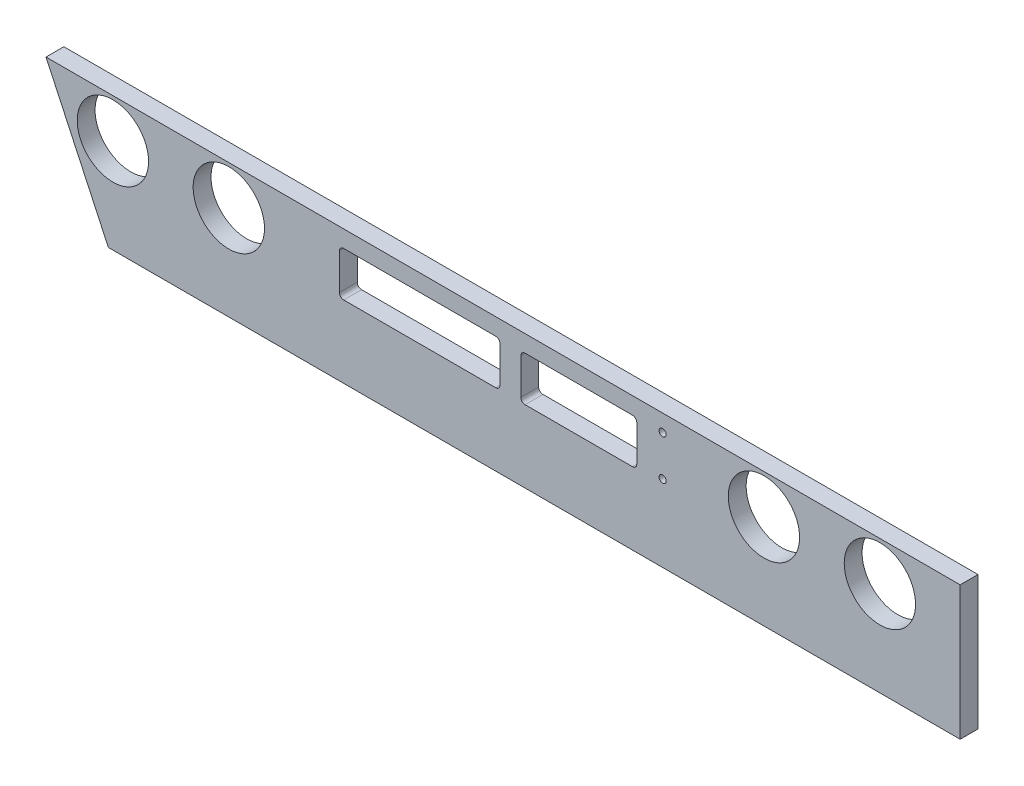
ISO-10303-21;
HEADER;
FILE_DESCRIPTION(('STEP AP214'),'2;1');
FILE_NAME('part.step','',(''),(''),'','','');
FILE_SCHEMA(('AUTOMOTIVE_DESIGN { 1 0 10303 214 1 1 1 1 }'));
ENDSEC;
DATA;
#1=APPLICATION_CONTEXT('core data for automotive mechanical design processes');
#2=APPLICATION_PROTOCOL_DEFINITION('international standard','automotive_design',2000,#1);
#3=PRODUCT_CONTEXT('',#1,'mechanical');
#4=PRODUCT('Part','Part','',(#3));
#5=PRODUCT_RELATED_PRODUCT_CATEGORY('part','',(#4));
#6=PRODUCT_DEFINITION_FORMATION('','',#4);
#7=PRODUCT_DEFINITION_CONTEXT('part definition',#1,'design');
#8=PRODUCT_DEFINITION('design','',#6,#7);
#9=PRODUCT_DEFINITION_SHAPE('','',#8);
#10=(LENGTH_UNIT() NAMED_UNIT(*) SI_UNIT(.MILLI.,.METRE.));
#11=(NAMED_UNIT(*) PLANE_ANGLE_UNIT() SI_UNIT($,.RADIAN.));
#12=(NAMED_UNIT(*) SI_UNIT($,.STERADIAN.) SOLID_ANGLE_UNIT());
#13=UNCERTAINTY_MEASURE_WITH_UNIT(LENGTH_MEASURE(1.E-05),#10,'distance_accuracy_value','');
#14=(GEOMETRIC_REPRESENTATION_CONTEXT(3) GLOBAL_UNCERTAINTY_ASSIGNED_CONTEXT((#13)) GLOBAL_UNIT_ASSIGNED_CONTEXT((#10,
#11,#12)) REPRESENTATION_CONTEXT('',''));
#15=CARTESIAN_POINT('',(0.,0.,0.));
#16=DIRECTION('',(0.,0.,1.));
#17=DIRECTION('',(1.,0.,0.));
#18=AXIS2_PLACEMENT_3D('',#15,#16,#17);
#19=CARTESIAN_POINT('',(-165.1,-23.8125,6.35));
#20=DIRECTION('',(0.,0.,1.));
#21=DIRECTION('',(1.,0.,0.));
#22=AXIS2_PLACEMENT_3D('',#19,#20,#21);
#23=PLANE('',#22);
#24=CARTESIAN_POINT('',(59.182,3.4671,6.35));
#25=DIRECTION('',(0.,0.,1.));
#26=DIRECTION('',(1.,0.,0.));
#27=AXIS2_PLACEMENT_3D('',#24,#25,#26);
#28=CIRCLE('',#27,1.27);
#29=CARTESIAN_POINT('',(60.452,3.4671,6.35));
#30=VERTEX_POINT('',#29);
#31=EDGE_CURVE('E349',#30,#30,#28,.T.);
#32=ORIENTED_EDGE('',*,*,#31,.F.);
#33=EDGE_LOOP('',(#32));
#34=FACE_BOUND('',#33,.T.);
#35=DIRECTION('',(0.,-1.,0.));
#36=VECTOR('',#35,1.);
#37=CARTESIAN_POINT('',(8.6995,16.256,6.35));
#38=LINE('',#37,#36);
#39=CARTESIAN_POINT('',(8.6995,16.256,6.35));
#40=VERTEX_POINT('',#39);
#41=CARTESIAN_POINT('',(8.6995,3.42899999999998,6.35));
#42=VERTEX_POINT('',#41);
#43=EDGE_CURVE('E343',#40,#42,#38,.T.);
#44=ORIENTED_EDGE('',*,*,#43,.F.);
#45=CARTESIAN_POINT('',(10.2235,16.256,6.35));
#46=DIRECTION('',(0.,0.,1.));
#47=DIRECTION('',(1.,0.,0.));
#48=AXIS2_PLACEMENT_3D('',#45,#46,#47);
#49=CIRCLE('',#48,1.524);
#50=CARTESIAN_POINT('',(10.2235,17.78,6.35));
#51=VERTEX_POINT('',#50);
#52=EDGE_CURVE('E309',#51,#40,#49,.T.);
#53=ORIENTED_EDGE('',*,*,#52,.F.);
#54=DIRECTION('',(-1.,0.,0.));
#55=VECTOR('',#54,1.);
#56=CARTESIAN_POINT('',(10.2235,17.78,6.35));
#57=LINE('',#56,#55);
#58=CARTESIAN_POINT('',(48.4505,17.78,6.35));
#59=VERTEX_POINT('',#58);
#60=EDGE_CURVE('E305',#59,#51,#57,.T.);
#61=ORIENTED_EDGE('',*,*,#60,.F.);
#62=CARTESIAN_POINT('',(48.4505,16.256,6.35));
#63=DIRECTION('',(0.,0.,1.));
#64=DIRECTION('',(-1.,0.,0.));
#65=AXIS2_PLACEMENT_3D('',#62,#63,#64);
#66=CIRCLE('',#65,1.524);
#67=CARTESIAN_POINT('',(49.9745,16.256,6.35));
#68=VERTEX_POINT('',#67);
#69=EDGE_CURVE('E333',#68,#59,#66,.T.);
#70=ORIENTED_EDGE('',*,*,#69,.F.);
#71=DIRECTION('',(0.,1.,0.));
#72=VECTOR('',#71,1.);
#73=CARTESIAN_POINT('',(49.9745,16.256,6.35));
#74=LINE('',#73,#72);
#75=CARTESIAN_POINT('',(49.9745,3.42899999999998,6.35));
#76=VERTEX_POINT('',#75);
#77=EDGE_CURVE('E335',#76,#68,#74,.T.);
#78=ORIENTED_EDGE('',*,*,#77,.F.);
#79=CARTESIAN_POINT('',(48.4505,3.42899999999998,6.35));
#80=DIRECTION('',(0.,0.,1.));
#81=DIRECTION('',(1.,0.,0.));
#82=AXIS2_PLACEMENT_3D('',#79,#80,#81);
#83=CIRCLE('',#82,1.524);
#84=CARTESIAN_POINT('',(48.4505,1.90499999999999,6.35));
#85=VERTEX_POINT('',#84);
#86=EDGE_CURVE('E337',#85,#76,#83,.T.);
#87=ORIENTED_EDGE('',*,*,#86,.F.);
#88=DIRECTION('',(1.,0.,0.));
#89=VECTOR('',#88,1.);
#90=CARTESIAN_POINT('',(10.2235,1.90499999999998,6.35));
#91=LINE('',#90,#89);
#92=CARTESIAN_POINT('',(10.2235,1.90499999999998,6.35));
#93=VERTEX_POINT('',#92);
#94=EDGE_CURVE('E339',#93,#85,#91,.T.);
#95=ORIENTED_EDGE('',*,*,#94,.F.);
#96=CARTESIAN_POINT('',(10.2235,3.42899999999998,6.35));
#97=DIRECTION('',(0.,0.,1.));
#98=DIRECTION('',(1.,0.,0.));
#99=AXIS2_PLACEMENT_3D('',#96,#97,#98);
#100=CIRCLE('',#99,1.524);
#101=EDGE_CURVE('E341',#42,#93,#100,.T.);
#102=ORIENTED_EDGE('',*,*,#101,.F.);
#103=EDGE_LOOP('',(#44,#53,#61,#70,#78,#87,#95,#102));
#104=FACE_BOUND('',#103,.T.);
#105=CARTESIAN_POINT('',(136.525,9.84250000000003,6.35));
#106=DIRECTION('',(0.,0.,1.));
#107=DIRECTION('',(-1.,0.,0.));
#108=AXIS2_PLACEMENT_3D('',#105,#106,#107);
#109=CIRCLE('',#108,12.7);
#110=CARTESIAN_POINT('',(123.825,9.84250000000003,6.35));
#111=VERTEX_POINT('',#110);
#112=EDGE_CURVE('E221',#111,#111,#109,.T.);
#113=ORIENTED_EDGE('',*,*,#112,.F.);
#114=EDGE_LOOP('',(#113));
#115=FACE_BOUND('',#114,.T.);
#116=CARTESIAN_POINT('',(-95.25,9.8425,6.35));
#117=DIRECTION('',(0.,0.,1.));
#118=DIRECTION('',(1.,0.,0.));
#119=AXIS2_PLACEMENT_3D('',#116,#117,#118);
#120=CIRCLE('',#119,12.7);
#121=CARTESIAN_POINT('',(-82.55,9.8425,6.35));
#122=VERTEX_POINT('',#121);
#123=EDGE_CURVE('E210',#122,#122,#120,.T.);
#124=ORIENTED_EDGE('',*,*,#123,.F.);
#125=EDGE_LOOP('',(#124));
#126=FACE_BOUND('',#125,.T.);
#127=CARTESIAN_POINT('',(-136.525,9.8425,6.35));
#128=DIRECTION('',(0.,0.,1.));
#129=DIRECTION('',(1.,0.,0.));
#130=AXIS2_PLACEMENT_3D('',#127,#128,#129);
#131=CIRCLE('',#130,12.7);
#132=CARTESIAN_POINT('',(-123.825,9.8425,6.35));
#133=VERTEX_POINT('',#132);
#134=EDGE_CURVE('E185',#133,#133,#131,.T.);
#135=ORIENTED_EDGE('',*,*,#134,.F.);
#136=EDGE_LOOP('',(#135));
#137=FACE_BOUND('',#136,.T.);
#138=CARTESIAN_POINT('',(95.25,9.84250000000002,6.35));
#139=DIRECTION('',(0.,0.,1.));
#140=DIRECTION('',(-1.,0.,0.));
#141=AXIS2_PLACEMENT_3D('',#138,#139,#140);
#142=CIRCLE('',#141,12.7);
#143=CARTESIAN_POINT('',(82.55,9.84250000000002,6.35));
#144=VERTEX_POINT('',#143);
#145=EDGE_CURVE('E215',#144,#144,#142,.T.);
#146=ORIENTED_EDGE('',*,*,#145,.F.);
#147=EDGE_LOOP('',(#146));
#148=FACE_BOUND('',#147,.T.);
#149=DIRECTION('',(0.,-1.,0.));
#150=VECTOR('',#149,1.);
#151=CARTESIAN_POINT('',(-55.88,16.256,6.35));
#152=LINE('',#151,#150);
#153=CARTESIAN_POINT('',(-55.88,16.256,6.35));
#154=VERTEX_POINT('',#153);
#155=CARTESIAN_POINT('',(-55.88,3.429,6.35));
#156=VERTEX_POINT('',#155);
#157=EDGE_CURVE('E286',#154,#156,#152,.T.);
#158=ORIENTED_EDGE('',*,*,#157,.F.);
#159=CARTESIAN_POINT('',(-54.356,16.256,6.35));
#160=DIRECTION('',(0.,0.,1.));
#161=DIRECTION('',(1.,0.,0.));
#162=AXIS2_PLACEMENT_3D('',#159,#160,#161);
#163=CIRCLE('',#162,1.52399999999999);
#164=CARTESIAN_POINT('',(-54.356,17.78,6.35));
#165=VERTEX_POINT('',#164);
#166=EDGE_CURVE('E251',#165,#154,#163,.T.);
#167=ORIENTED_EDGE('',*,*,#166,.F.);
#168=DIRECTION('',(-1.,0.,0.));
#169=VECTOR('',#168,1.);
#170=CARTESIAN_POINT('',(-54.356,17.78,6.35));
#171=LINE('',#170,#169);
#172=CARTESIAN_POINT('',(-0.253999999999976,17.78,6.35));
#173=VERTEX_POINT('',#172);
#174=EDGE_CURVE('E247',#173,#165,#171,.T.);
#175=ORIENTED_EDGE('',*,*,#174,.F.);
#176=CARTESIAN_POINT('',(-0.25399999999999,16.256,6.35));
#177=DIRECTION('',(0.,0.,1.));
#178=DIRECTION('',(-1.,0.,0.));
#179=AXIS2_PLACEMENT_3D('',#176,#177,#178);
#180=CIRCLE('',#179,1.52399999999999);
#181=CARTESIAN_POINT('',(1.27,16.256,6.35));
#182=VERTEX_POINT('',#181);
#183=EDGE_CURVE('E275',#182,#173,#180,.T.);
#184=ORIENTED_EDGE('',*,*,#183,.F.);
#185=DIRECTION('',(0.,1.,0.));
#186=VECTOR('',#185,1.);
#187=CARTESIAN_POINT('',(1.27,16.256,6.35));
#188=LINE('',#187,#186);
#189=CARTESIAN_POINT('',(1.27000000000001,3.42900000000001,6.35));
#190=VERTEX_POINT('',#189);
#191=EDGE_CURVE('E278',#190,#182,#188,.T.);
#192=ORIENTED_EDGE('',*,*,#191,.F.);
#193=CARTESIAN_POINT('',(-0.25399999999999,3.42899999999999,6.35));
#194=DIRECTION('',(0.,0.,1.));
#195=DIRECTION('',(1.,0.,0.));
#196=AXIS2_PLACEMENT_3D('',#193,#194,#195);
#197=CIRCLE('',#196,1.524);
#198=CARTESIAN_POINT('',(-0.253999999999991,1.90499999999999,6.35));
#199=VERTEX_POINT('',#198);
#200=EDGE_CURVE('E280',#199,#190,#197,.T.);
#201=ORIENTED_EDGE('',*,*,#200,.F.);
#202=DIRECTION('',(1.,0.,0.));
#203=VECTOR('',#202,1.);
#204=CARTESIAN_POINT('',(-54.356,1.905,6.35));
#205=LINE('',#204,#203);
#206=CARTESIAN_POINT('',(-54.356,1.905,6.35));
#207=VERTEX_POINT('',#206);
#208=EDGE_CURVE('E282',#207,#199,#205,.T.);
#209=ORIENTED_EDGE('',*,*,#208,.F.);
#210=CARTESIAN_POINT('',(-54.356,3.429,6.35));
#211=DIRECTION('',(0.,0.,1.));
#212=DIRECTION('',(1.,0.,0.));
#213=AXIS2_PLACEMENT_3D('',#210,#211,#212);
#214=CIRCLE('',#213,1.52399999999999);
#215=EDGE_CURVE('E284',#156,#207,#214,.T.);
#216=ORIENTED_EDGE('',*,*,#215,.F.);
#217=EDGE_LOOP('',(#158,#167,#175,#184,#192,#201,#209,#216));
#218=FACE_BOUND('',#217,.T.);
#219=CARTESIAN_POINT('',(59.182,17.7673,6.35));
#220=DIRECTION('',(0.,0.,1.));
#221=DIRECTION('',(1.,0.,0.));
#222=AXIS2_PLACEMENT_3D('',#219,#220,#221);
#223=CIRCLE('',#222,1.27);
#224=CARTESIAN_POINT('',(60.452,17.7673,6.35));
#225=VERTEX_POINT('',#224);
#226=EDGE_CURVE('E331',#225,#225,#223,.T.);
#227=ORIENTED_EDGE('',*,*,#226,.F.);
#228=EDGE_LOOP('',(#227));
#229=FACE_BOUND('',#228,.T.);
#230=DIRECTION('',(-1.,0.,0.));
#231=VECTOR('',#230,1.);
#232=CARTESIAN_POINT('',(-165.1,23.8125,6.35));
#233=LINE('',#232,#231);
#234=CARTESIAN_POINT('',(165.1,23.8125000000001,6.35));
#235=VERTEX_POINT('',#234);
#236=CARTESIAN_POINT('',(-160.3375,23.8125,6.35));
#237=VERTEX_POINT('',#236);
#238=EDGE_CURVE('E193',#235,#237,#233,.T.);
#239=ORIENTED_EDGE('',*,*,#238,.T.);
#240=DIRECTION('',(-0.422614725462889,0.906309436021675,0.));
#241=VECTOR('',#240,1.);
#242=CARTESIAN_POINT('',(-167.773483559516,39.7591806527159,6.35));
#243=LINE('',#242,#241);
#244=CARTESIAN_POINT('',(-138.129824011852,-23.8125,6.35));
#245=VERTEX_POINT('',#244);
#246=EDGE_CURVE('E45',#245,#237,#243,.T.);
#247=ORIENTED_EDGE('',*,*,#246,.F.);
#248=DIRECTION('',(1.,0.,0.));
#249=VECTOR('',#248,1.);
#250=CARTESIAN_POINT('',(-165.1,-23.8125,6.35));
#251=LINE('',#250,#249);
#252=CARTESIAN_POINT('',(165.1,-23.8125,6.35));
#253=VERTEX_POINT('',#252);
#254=EDGE_CURVE('E179',#245,#253,#251,.T.);
#255=ORIENTED_EDGE('',*,*,#254,.T.);
#256=DIRECTION('',(0.,1.,0.));
#257=VECTOR('',#256,1.);
#258=CARTESIAN_POINT('',(165.1,23.8125000000001,6.35));
#259=LINE('',#258,#257);
#260=EDGE_CURVE('E203',#253,#235,#259,.T.);
#261=ORIENTED_EDGE('',*,*,#260,.T.);
#262=EDGE_LOOP('',(#239,#247,#255,#261));
#263=FACE_BOUND('',#262,.T.);
#264=ADVANCED_FACE('F31',(#34,#104,#115,#126,#137,#148,#218,#229,#263),#23,.T.);
#265=CARTESIAN_POINT('',(-165.1,-23.8125,0.));
#266=DIRECTION('',(0.,0.,1.));
#267=DIRECTION('',(1.,0.,0.));
#268=AXIS2_PLACEMENT_3D('',#265,#266,#267);
#269=PLANE('',#268);
#270=CARTESIAN_POINT('',(59.182,3.4671,0.));
#271=DIRECTION('',(0.,0.,1.));
#272=DIRECTION('',(1.,0.,0.));
#273=AXIS2_PLACEMENT_3D('',#270,#271,#272);
#274=CIRCLE('',#273,1.27);
#275=CARTESIAN_POINT('',(60.452,3.4671,0.));
#276=VERTEX_POINT('',#275);
#277=EDGE_CURVE('E180',#276,#276,#274,.T.);
#278=ORIENTED_EDGE('',*,*,#277,.T.);
#279=EDGE_LOOP('',(#278));
#280=FACE_BOUND('',#279,.T.);
#281=CARTESIAN_POINT('',(10.2235,16.256,0.));
#282=DIRECTION('',(0.,0.,1.));
#283=DIRECTION('',(1.,0.,0.));
#284=AXIS2_PLACEMENT_3D('',#281,#282,#283);
#285=CIRCLE('',#284,1.524);
#286=CARTESIAN_POINT('',(10.2235,17.78,0.));
#287=VERTEX_POINT('',#286);
#288=CARTESIAN_POINT('',(8.6995,16.256,0.));
#289=VERTEX_POINT('',#288);
#290=EDGE_CURVE('E328',#287,#289,#285,.T.);
#291=ORIENTED_EDGE('',*,*,#290,.T.);
#292=DIRECTION('',(0.,-1.,0.));
#293=VECTOR('',#292,1.);
#294=CARTESIAN_POINT('',(8.6995,16.256,0.));
#295=LINE('',#294,#293);
#296=CARTESIAN_POINT('',(8.6995,3.42899999999998,0.));
#297=VERTEX_POINT('',#296);
#298=EDGE_CURVE('E325',#289,#297,#295,.T.);
#299=ORIENTED_EDGE('',*,*,#298,.T.);
#300=CARTESIAN_POINT('',(10.2235,3.42899999999998,0.));
#301=DIRECTION('',(0.,0.,1.));
#302=DIRECTION('',(1.,0.,0.));
#303=AXIS2_PLACEMENT_3D('',#300,#301,#302);
#304=CIRCLE('',#303,1.524);
#305=CARTESIAN_POINT('',(10.2235,1.90499999999998,0.));
#306=VERTEX_POINT('',#305);
#307=EDGE_CURVE('E322',#297,#306,#304,.T.);
#308=ORIENTED_EDGE('',*,*,#307,.T.);
#309=DIRECTION('',(1.,0.,0.));
#310=VECTOR('',#309,1.);
#311=CARTESIAN_POINT('',(10.2235,1.90499999999998,0.));
#312=LINE('',#311,#310);
#313=CARTESIAN_POINT('',(48.4505,1.90499999999999,0.));
#314=VERTEX_POINT('',#313);
#315=EDGE_CURVE('E319',#306,#314,#312,.T.);
#316=ORIENTED_EDGE('',*,*,#315,.T.);
#317=CARTESIAN_POINT('',(48.4505,3.42899999999998,0.));
#318=DIRECTION('',(0.,0.,1.));
#319=DIRECTION('',(1.,0.,0.));
#320=AXIS2_PLACEMENT_3D('',#317,#318,#319);
#321=CIRCLE('',#320,1.524);
#322=CARTESIAN_POINT('',(49.9745,3.42899999999998,0.));
#323=VERTEX_POINT('',#322);
#324=EDGE_CURVE('E316',#314,#323,#321,.T.);
#325=ORIENTED_EDGE('',*,*,#324,.T.);
#326=DIRECTION('',(0.,1.,0.));
#327=VECTOR('',#326,1.);
#328=CARTESIAN_POINT('',(49.9745,16.256,0.));
#329=LINE('',#328,#327);
#330=CARTESIAN_POINT('',(49.9745,16.256,0.));
#331=VERTEX_POINT('',#330);
#332=EDGE_CURVE('E313',#323,#331,#329,.T.);
#333=ORIENTED_EDGE('',*,*,#332,.T.);
#334=CARTESIAN_POINT('',(48.4505,16.256,0.));
#335=DIRECTION('',(0.,0.,1.));
#336=DIRECTION('',(-1.,0.,0.));
#337=AXIS2_PLACEMENT_3D('',#334,#335,#336);
#338=CIRCLE('',#337,1.524);
#339=CARTESIAN_POINT('',(48.4505,17.78,0.));
#340=VERTEX_POINT('',#339);
#341=EDGE_CURVE('E310',#331,#340,#338,.T.);
#342=ORIENTED_EDGE('',*,*,#341,.T.);
#343=DIRECTION('',(-1.,0.,0.));
#344=VECTOR('',#343,1.);
#345=CARTESIAN_POINT('',(10.2235,17.78,0.));
#346=LINE('',#345,#344);
#347=EDGE_CURVE('E306',#340,#287,#346,.T.);
#348=ORIENTED_EDGE('',*,*,#347,.T.);
#349=EDGE_LOOP('',(#291,#299,#308,#316,#325,#333,#342,#348));
#350=FACE_BOUND('',#349,.T.);
#351=CARTESIAN_POINT('',(136.525,9.84250000000003,0.));
#352=DIRECTION('',(0.,0.,1.));
#353=DIRECTION('',(-1.,0.,0.));
#354=AXIS2_PLACEMENT_3D('',#351,#352,#353);
#355=CIRCLE('',#354,12.7);
#356=CARTESIAN_POINT('',(123.825,9.84250000000003,0.));
#357=VERTEX_POINT('',#356);
#358=EDGE_CURVE('E224',#357,#357,#355,.T.);
#359=ORIENTED_EDGE('',*,*,#358,.T.);
#360=EDGE_LOOP('',(#359));
#361=FACE_BOUND('',#360,.T.);
#362=CARTESIAN_POINT('',(-95.25,9.8425,0.));
#363=DIRECTION('',(0.,0.,1.));
#364=DIRECTION('',(1.,0.,0.));
#365=AXIS2_PLACEMENT_3D('',#362,#363,#364);
#366=CIRCLE('',#365,12.7);
#367=CARTESIAN_POINT('',(-82.55,9.8425,0.));
#368=VERTEX_POINT('',#367);
#369=EDGE_CURVE('E212',#368,#368,#366,.T.);
#370=ORIENTED_EDGE('',*,*,#369,.T.);
#371=EDGE_LOOP('',(#370));
#372=FACE_BOUND('',#371,.T.);
#373=CARTESIAN_POINT('',(-136.525,9.8425,0.));
#374=DIRECTION('',(0.,0.,1.));
#375=DIRECTION('',(1.,0.,0.));
#376=AXIS2_PLACEMENT_3D('',#373,#374,#375);
#377=CIRCLE('',#376,12.7);
#378=CARTESIAN_POINT('',(-123.825,9.8425,0.));
#379=VERTEX_POINT('',#378);
#380=EDGE_CURVE('E190',#379,#379,#377,.T.);
#381=ORIENTED_EDGE('',*,*,#380,.T.);
#382=EDGE_LOOP('',(#381));
#383=FACE_BOUND('',#382,.T.);
#384=CARTESIAN_POINT('',(95.25,9.84250000000002,0.));
#385=DIRECTION('',(0.,0.,1.));
#386=DIRECTION('',(-1.,0.,0.));
#387=AXIS2_PLACEMENT_3D('',#384,#385,#386);
#388=CIRCLE('',#387,12.7);
#389=CARTESIAN_POINT('',(82.55,9.84250000000002,0.));
#390=VERTEX_POINT('',#389);
#391=EDGE_CURVE('E218',#390,#390,#388,.T.);
#392=ORIENTED_EDGE('',*,*,#391,.T.);
#393=EDGE_LOOP('',(#392));
#394=FACE_BOUND('',#393,.T.);
#395=CARTESIAN_POINT('',(-54.356,16.256,0.));
#396=DIRECTION('',(0.,0.,1.));
#397=DIRECTION('',(1.,0.,0.));
#398=AXIS2_PLACEMENT_3D('',#395,#396,#397);
#399=CIRCLE('',#398,1.52399999999999);
#400=CARTESIAN_POINT('',(-54.356,17.78,0.));
#401=VERTEX_POINT('',#400);
#402=CARTESIAN_POINT('',(-55.88,16.256,0.));
#403=VERTEX_POINT('',#402);
#404=EDGE_CURVE('E270',#401,#403,#399,.T.);
#405=ORIENTED_EDGE('',*,*,#404,.T.);
#406=DIRECTION('',(0.,-1.,0.));
#407=VECTOR('',#406,1.);
#408=CARTESIAN_POINT('',(-55.88,16.256,0.));
#409=LINE('',#408,#407);
#410=CARTESIAN_POINT('',(-55.88,3.429,0.));
#411=VERTEX_POINT('',#410);
#412=EDGE_CURVE('E267',#403,#411,#409,.T.);
#413=ORIENTED_EDGE('',*,*,#412,.T.);
#414=CARTESIAN_POINT('',(-54.356,3.429,0.));
#415=DIRECTION('',(0.,0.,1.));
#416=DIRECTION('',(1.,0.,0.));
#417=AXIS2_PLACEMENT_3D('',#414,#415,#416);
#418=CIRCLE('',#417,1.52399999999999);
#419=CARTESIAN_POINT('',(-54.356,1.905,0.));
#420=VERTEX_POINT('',#419);
#421=EDGE_CURVE('E264',#411,#420,#418,.T.);
#422=ORIENTED_EDGE('',*,*,#421,.T.);
#423=DIRECTION('',(1.,0.,0.));
#424=VECTOR('',#423,1.);
#425=CARTESIAN_POINT('',(-54.356,1.905,0.));
#426=LINE('',#425,#424);
#427=CARTESIAN_POINT('',(-0.253999999999991,1.90499999999999,0.));
#428=VERTEX_POINT('',#427);
#429=EDGE_CURVE('E261',#420,#428,#426,.T.);
#430=ORIENTED_EDGE('',*,*,#429,.T.);
#431=CARTESIAN_POINT('',(-0.25399999999999,3.42899999999999,0.));
#432=DIRECTION('',(0.,0.,1.));
#433=DIRECTION('',(1.,0.,0.));
#434=AXIS2_PLACEMENT_3D('',#431,#432,#433);
#435=CIRCLE('',#434,1.524);
#436=CARTESIAN_POINT('',(1.27000000000001,3.42900000000001,0.));
#437=VERTEX_POINT('',#436);
#438=EDGE_CURVE('E258',#428,#437,#435,.T.);
#439=ORIENTED_EDGE('',*,*,#438,.T.);
#440=DIRECTION('',(0.,1.,0.));
#441=VECTOR('',#440,1.);
#442=CARTESIAN_POINT('',(1.27,16.256,0.));
#443=LINE('',#442,#441);
#444=CARTESIAN_POINT('',(1.27,16.256,0.));
#445=VERTEX_POINT('',#444);
#446=EDGE_CURVE('E255',#437,#445,#443,.T.);
#447=ORIENTED_EDGE('',*,*,#446,.T.);
#448=CARTESIAN_POINT('',(-0.25399999999999,16.256,0.));
#449=DIRECTION('',(0.,0.,1.));
#450=DIRECTION('',(-1.,0.,0.));
#451=AXIS2_PLACEMENT_3D('',#448,#449,#450);
#452=CIRCLE('',#451,1.52399999999999);
#453=CARTESIAN_POINT('',(-0.25399999999999,17.78,0.));
#454=VERTEX_POINT('',#453);
#455=EDGE_CURVE('E252',#445,#454,#452,.T.);
#456=ORIENTED_EDGE('',*,*,#455,.T.);
#457=DIRECTION('',(-1.,0.,0.));
#458=VECTOR('',#457,1.);
#459=CARTESIAN_POINT('',(-54.356,17.78,0.));
#460=LINE('',#459,#458);
#461=EDGE_CURVE('E248',#454,#401,#460,.T.);
#462=ORIENTED_EDGE('',*,*,#461,.T.);
#463=EDGE_LOOP('',(#405,#413,#422,#430,#439,#447,#456,#462));
#464=FACE_BOUND('',#463,.T.);
#465=CARTESIAN_POINT('',(59.182,17.7673,0.));
#466=DIRECTION('',(0.,0.,1.));
#467=DIRECTION('',(1.,0.,0.));
#468=AXIS2_PLACEMENT_3D('',#465,#466,#467);
#469=CIRCLE('',#468,1.27);
#470=CARTESIAN_POINT('',(60.452,17.7673,0.));
#471=VERTEX_POINT('',#470);
#472=EDGE_CURVE('E346',#471,#471,#469,.T.);
#473=ORIENTED_EDGE('',*,*,#472,.T.);
#474=EDGE_LOOP('',(#473));
#475=FACE_BOUND('',#474,.T.);
#476=DIRECTION('',(-0.422614725462889,0.906309436021675,0.));
#477=VECTOR('',#476,1.);
#478=CARTESIAN_POINT('',(-167.773483559516,39.7591806527159,0.));
#479=LINE('',#478,#477);
#480=CARTESIAN_POINT('',(-138.129824011852,-23.8125,0.));
#481=VERTEX_POINT('',#480);
#482=CARTESIAN_POINT('',(-160.3375,23.8125,0.));
#483=VERTEX_POINT('',#482);
#484=EDGE_CURVE('E165',#481,#483,#479,.T.);
#485=ORIENTED_EDGE('',*,*,#484,.T.);
#486=DIRECTION('',(-1.,0.,0.));
#487=VECTOR('',#486,1.);
#488=CARTESIAN_POINT('',(-165.1,23.8125,0.));
#489=LINE('',#488,#487);
#490=CARTESIAN_POINT('',(165.1,23.8125000000001,0.));
#491=VERTEX_POINT('',#490);
#492=EDGE_CURVE('E187',#491,#483,#489,.T.);
#493=ORIENTED_EDGE('',*,*,#492,.F.);
#494=DIRECTION('',(0.,1.,0.));
#495=VECTOR('',#494,1.);
#496=CARTESIAN_POINT('',(165.1,23.8125000000001,0.));
#497=LINE('',#496,#495);
#498=CARTESIAN_POINT('',(165.1,-23.8125,0.));
#499=VERTEX_POINT('',#498);
#500=EDGE_CURVE('E184',#499,#491,#497,.T.);
#501=ORIENTED_EDGE('',*,*,#500,.F.);
#502=DIRECTION('',(1.,0.,0.));
#503=VECTOR('',#502,1.);
#504=CARTESIAN_POINT('',(-165.1,-23.8125,0.));
#505=LINE('',#504,#503);
#506=EDGE_CURVE('E177',#481,#499,#505,.T.);
#507=ORIENTED_EDGE('',*,*,#506,.F.);
#508=EDGE_LOOP('',(#485,#493,#501,#507));
#509=FACE_BOUND('',#508,.T.);
#510=ADVANCED_FACE('F183',(#280,#350,#361,#372,#383,#394,#464,#475,#509),#269,.F.);
#511=CARTESIAN_POINT('',(-165.1,-23.8125,6.35));
#512=DIRECTION('',(0.,1.,0.));
#513=DIRECTION('',(0.,0.,1.));
#514=AXIS2_PLACEMENT_3D('',#511,#512,#513);
#515=PLANE('',#514);
#516=DIRECTION('',(0.,0.,1.));
#517=VECTOR('',#516,1.);
#518=CARTESIAN_POINT('',(-138.129824011852,-23.8125,6.35));
#519=LINE('',#518,#517);
#520=EDGE_CURVE('E168',#481,#245,#519,.T.);
#521=ORIENTED_EDGE('',*,*,#520,.F.);
#522=ORIENTED_EDGE('',*,*,#506,.T.);
#523=DIRECTION('',(0.,0.,-1.));
#524=VECTOR('',#523,1.);
#525=CARTESIAN_POINT('',(165.1,-23.8125,6.35));
#526=LINE('',#525,#524);
#527=EDGE_CURVE('E39',#253,#499,#526,.T.);
#528=ORIENTED_EDGE('',*,*,#527,.F.);
#529=ORIENTED_EDGE('',*,*,#254,.F.);
#530=EDGE_LOOP('',(#521,#522,#528,#529));
#531=FACE_BOUND('',#530,.T.);
#532=ADVANCED_FACE('F33',(#531),#515,.F.);
#533=CARTESIAN_POINT('',(-165.1,23.8125,6.35));
#534=DIRECTION('',(0.,-1.,0.));
#535=DIRECTION('',(1.,0.,0.));
#536=AXIS2_PLACEMENT_3D('',#533,#534,#535);
#537=PLANE('',#536);
#538=DIRECTION('',(0.,0.,-1.));
#539=VECTOR('',#538,1.);
#540=CARTESIAN_POINT('',(-160.3375,23.8125,6.35));
#541=LINE('',#540,#539);
#542=EDGE_CURVE('E11',#237,#483,#541,.T.);
#543=ORIENTED_EDGE('',*,*,#542,.F.);
#544=ORIENTED_EDGE('',*,*,#238,.F.);
#545=DIRECTION('',(0.,0.,-1.));
#546=VECTOR('',#545,1.);
#547=CARTESIAN_POINT('',(165.1,23.8125000000001,6.35));
#548=LINE('',#547,#546);
#549=EDGE_CURVE('E197',#235,#491,#548,.T.);
#550=ORIENTED_EDGE('',*,*,#549,.T.);
#551=ORIENTED_EDGE('',*,*,#492,.T.);
#552=EDGE_LOOP('',(#543,#544,#550,#551));
#553=FACE_BOUND('',#552,.T.);
#554=ADVANCED_FACE('F382',(#553),#537,.F.);
#555=CARTESIAN_POINT('',(165.1,23.8125000000001,6.35));
#556=DIRECTION('',(-1.,0.,0.));
#557=DIRECTION('',(0.,0.,1.));
#558=AXIS2_PLACEMENT_3D('',#555,#556,#557);
#559=PLANE('',#558);
#560=ORIENTED_EDGE('',*,*,#500,.T.);
#561=ORIENTED_EDGE('',*,*,#549,.F.);
#562=ORIENTED_EDGE('',*,*,#260,.F.);
#563=ORIENTED_EDGE('',*,*,#527,.T.);
#564=EDGE_LOOP('',(#560,#561,#562,#563));
#565=FACE_BOUND('',#564,.T.);
#566=ADVANCED_FACE('F201',(#565),#559,.F.);
#567=CARTESIAN_POINT('',(-136.525,9.8425,6.35));
#568=DIRECTION('',(0.,0.,-1.));
#569=DIRECTION('',(-1.,0.,0.));
#570=AXIS2_PLACEMENT_3D('',#567,#568,#569);
#571=CYLINDRICAL_SURFACE('',#570,12.7);
#572=ORIENTED_EDGE('',*,*,#134,.T.);
#573=EDGE_LOOP('',(#572));
#574=FACE_BOUND('',#573,.T.);
#575=ORIENTED_EDGE('',*,*,#380,.F.);
#576=EDGE_LOOP('',(#575));
#577=FACE_BOUND('',#576,.T.);
#578=ADVANCED_FACE('F389',(#574,#577),#571,.F.);
#579=CARTESIAN_POINT('',(-95.25,9.8425,6.35));
#580=DIRECTION('',(0.,0.,-1.));
#581=DIRECTION('',(-1.,0.,0.));
#582=AXIS2_PLACEMENT_3D('',#579,#580,#581);
#583=CYLINDRICAL_SURFACE('',#582,12.7);
#584=ORIENTED_EDGE('',*,*,#123,.T.);
#585=EDGE_LOOP('',(#584));
#586=FACE_BOUND('',#585,.T.);
#587=ORIENTED_EDGE('',*,*,#369,.F.);
#588=EDGE_LOOP('',(#587));
#589=FACE_BOUND('',#588,.T.);
#590=ADVANCED_FACE('F396',(#586,#589),#583,.F.);
#591=CARTESIAN_POINT('',(95.25,9.84250000000002,6.35));
#592=DIRECTION('',(0.,0.,-1.));
#593=DIRECTION('',(-1.,0.,0.));
#594=AXIS2_PLACEMENT_3D('',#591,#592,#593);
#595=CYLINDRICAL_SURFACE('',#594,12.7);
#596=ORIENTED_EDGE('',*,*,#145,.T.);
#597=EDGE_LOOP('',(#596));
#598=FACE_BOUND('',#597,.T.);
#599=ORIENTED_EDGE('',*,*,#391,.F.);
#600=EDGE_LOOP('',(#599));
#601=FACE_BOUND('',#600,.T.);
#602=ADVANCED_FACE('F400',(#598,#601),#595,.F.);
#603=CARTESIAN_POINT('',(136.525,9.84250000000003,6.35));
#604=DIRECTION('',(0.,0.,-1.));
#605=DIRECTION('',(-1.,0.,0.));
#606=AXIS2_PLACEMENT_3D('',#603,#604,#605);
#607=CYLINDRICAL_SURFACE('',#606,12.7);
#608=ORIENTED_EDGE('',*,*,#112,.T.);
#609=EDGE_LOOP('',(#608));
#610=FACE_BOUND('',#609,.T.);
#611=ORIENTED_EDGE('',*,*,#358,.F.);
#612=EDGE_LOOP('',(#611));
#613=FACE_BOUND('',#612,.T.);
#614=ADVANCED_FACE('F404',(#610,#613),#607,.F.);
#615=CARTESIAN_POINT('',(-54.356,16.256,6.35));
#616=DIRECTION('',(0.,0.,-1.));
#617=DIRECTION('',(-1.,0.,0.));
#618=AXIS2_PLACEMENT_3D('',#615,#616,#617);
#619=CYLINDRICAL_SURFACE('',#618,1.52399999999999);
#620=ORIENTED_EDGE('',*,*,#404,.F.);
#621=DIRECTION('',(0.,0.,-1.));
#622=VECTOR('',#621,1.);
#623=CARTESIAN_POINT('',(-54.356,17.78,6.35));
#624=LINE('',#623,#622);
#625=EDGE_CURVE('E244',#165,#401,#624,.T.);
#626=ORIENTED_EDGE('',*,*,#625,.F.);
#627=ORIENTED_EDGE('',*,*,#166,.T.);
#628=DIRECTION('',(0.,0.,-1.));
#629=VECTOR('',#628,1.);
#630=CARTESIAN_POINT('',(-55.88,16.256,6.35));
#631=LINE('',#630,#629);
#632=EDGE_CURVE('E227',#154,#403,#631,.T.);
#633=ORIENTED_EDGE('',*,*,#632,.T.);
#634=EDGE_LOOP('',(#620,#626,#627,#633));
#635=FACE_BOUND('',#634,.T.);
#636=ADVANCED_FACE('F408',(#635),#619,.F.);
#637=CARTESIAN_POINT('',(-55.88,16.256,6.35));
#638=DIRECTION('',(1.,0.,0.));
#639=DIRECTION('',(0.,0.,-1.));
#640=AXIS2_PLACEMENT_3D('',#637,#638,#639);
#641=PLANE('',#640);
#642=ORIENTED_EDGE('',*,*,#412,.F.);
#643=ORIENTED_EDGE('',*,*,#632,.F.);
#644=ORIENTED_EDGE('',*,*,#157,.T.);
#645=DIRECTION('',(0.,0.,-1.));
#646=VECTOR('',#645,1.);
#647=CARTESIAN_POINT('',(-55.88,3.429,6.35));
#648=LINE('',#647,#646);
#649=EDGE_CURVE('E232',#156,#411,#648,.T.);
#650=ORIENTED_EDGE('',*,*,#649,.T.);
#651=EDGE_LOOP('',(#642,#643,#644,#650));
#652=FACE_BOUND('',#651,.T.);
#653=ADVANCED_FACE('F412',(#652),#641,.T.);
#654=CARTESIAN_POINT('',(-54.356,3.429,6.35));
#655=DIRECTION('',(0.,0.,-1.));
#656=DIRECTION('',(-1.,0.,0.));
#657=AXIS2_PLACEMENT_3D('',#654,#655,#656);
#658=CYLINDRICAL_SURFACE('',#657,1.52399999999999);
#659=ORIENTED_EDGE('',*,*,#421,.F.);
#660=ORIENTED_EDGE('',*,*,#649,.F.);
#661=ORIENTED_EDGE('',*,*,#215,.T.);
#662=DIRECTION('',(0.,0.,-1.));
#663=VECTOR('',#662,1.);
#664=CARTESIAN_POINT('',(-54.356,1.905,6.35));
#665=LINE('',#664,#663);
#666=EDGE_CURVE('E234',#207,#420,#665,.T.);
#667=ORIENTED_EDGE('',*,*,#666,.T.);
#668=EDGE_LOOP('',(#659,#660,#661,#667));
#669=FACE_BOUND('',#668,.T.);
#670=ADVANCED_FACE('F416',(#669),#658,.F.);
#671=CARTESIAN_POINT('',(-54.356,1.905,6.35));
#672=DIRECTION('',(0.,1.,0.));
#673=DIRECTION('',(-1.,0.,0.));
#674=AXIS2_PLACEMENT_3D('',#671,#672,#673);
#675=PLANE('',#674);
#676=ORIENTED_EDGE('',*,*,#429,.F.);
#677=ORIENTED_EDGE('',*,*,#666,.F.);
#678=ORIENTED_EDGE('',*,*,#208,.T.);
#679=DIRECTION('',(0.,0.,-1.));
#680=VECTOR('',#679,1.);
#681=CARTESIAN_POINT('',(-0.253999999999991,1.90499999999999,6.35));
#682=LINE('',#681,#680);
#683=EDGE_CURVE('E236',#199,#428,#682,.T.);
#684=ORIENTED_EDGE('',*,*,#683,.T.);
#685=EDGE_LOOP('',(#676,#677,#678,#684));
#686=FACE_BOUND('',#685,.T.);
#687=ADVANCED_FACE('F420',(#686),#675,.T.);
#688=CARTESIAN_POINT('',(-0.25399999999999,3.42899999999999,6.35));
#689=DIRECTION('',(0.,0.,-1.));
#690=DIRECTION('',(-1.,0.,0.));
#691=AXIS2_PLACEMENT_3D('',#688,#689,#690);
#692=CYLINDRICAL_SURFACE('',#691,1.524);
#693=ORIENTED_EDGE('',*,*,#438,.F.);
#694=ORIENTED_EDGE('',*,*,#683,.F.);
#695=ORIENTED_EDGE('',*,*,#200,.T.);
#696=DIRECTION('',(0.,0.,-1.));
#697=VECTOR('',#696,1.);
#698=CARTESIAN_POINT('',(1.27000000000001,3.42900000000001,6.35));
#699=LINE('',#698,#697);
#700=EDGE_CURVE('E238',#190,#437,#699,.T.);
#701=ORIENTED_EDGE('',*,*,#700,.T.);
#702=EDGE_LOOP('',(#693,#694,#695,#701));
#703=FACE_BOUND('',#702,.T.);
#704=ADVANCED_FACE('F424',(#703),#692,.F.);
#705=CARTESIAN_POINT('',(1.27,16.256,6.35));
#706=DIRECTION('',(-1.,0.,0.));
#707=DIRECTION('',(0.,-1.,0.));
#708=AXIS2_PLACEMENT_3D('',#705,#706,#707);
#709=PLANE('',#708);
#710=ORIENTED_EDGE('',*,*,#446,.F.);
#711=ORIENTED_EDGE('',*,*,#700,.F.);
#712=ORIENTED_EDGE('',*,*,#191,.T.);
#713=DIRECTION('',(0.,0.,-1.));
#714=VECTOR('',#713,1.);
#715=CARTESIAN_POINT('',(1.27,16.256,6.35));
#716=LINE('',#715,#714);
#717=EDGE_CURVE('E240',#182,#445,#716,.T.);
#718=ORIENTED_EDGE('',*,*,#717,.T.);
#719=EDGE_LOOP('',(#710,#711,#712,#718));
#720=FACE_BOUND('',#719,.T.);
#721=ADVANCED_FACE('F428',(#720),#709,.T.);
#722=CARTESIAN_POINT('',(-0.25399999999999,16.256,6.35));
#723=DIRECTION('',(0.,0.,-1.));
#724=DIRECTION('',(-1.,0.,0.));
#725=AXIS2_PLACEMENT_3D('',#722,#723,#724);
#726=CYLINDRICAL_SURFACE('',#725,1.52399999999999);
#727=ORIENTED_EDGE('',*,*,#455,.F.);
#728=ORIENTED_EDGE('',*,*,#717,.F.);
#729=ORIENTED_EDGE('',*,*,#183,.T.);
#730=DIRECTION('',(0.,0.,-1.));
#731=VECTOR('',#730,1.);
#732=CARTESIAN_POINT('',(-0.25399999999999,17.78,6.35));
#733=LINE('',#732,#731);
#734=EDGE_CURVE('E242',#173,#454,#733,.T.);
#735=ORIENTED_EDGE('',*,*,#734,.T.);
#736=EDGE_LOOP('',(#727,#728,#729,#735));
#737=FACE_BOUND('',#736,.T.);
#738=ADVANCED_FACE('F432',(#737),#726,.F.);
#739=CARTESIAN_POINT('',(-54.356,17.78,6.35));
#740=DIRECTION('',(0.,-1.,0.));
#741=DIRECTION('',(1.,0.,0.));
#742=AXIS2_PLACEMENT_3D('',#739,#740,#741);
#743=PLANE('',#742);
#744=ORIENTED_EDGE('',*,*,#461,.F.);
#745=ORIENTED_EDGE('',*,*,#734,.F.);
#746=ORIENTED_EDGE('',*,*,#174,.T.);
#747=ORIENTED_EDGE('',*,*,#625,.T.);
#748=EDGE_LOOP('',(#744,#745,#746,#747));
#749=FACE_BOUND('',#748,.T.);
#750=ADVANCED_FACE('F436',(#749),#743,.T.);
#751=CARTESIAN_POINT('',(10.2235,16.256,6.35));
#752=DIRECTION('',(0.,0.,-1.));
#753=DIRECTION('',(-1.,0.,0.));
#754=AXIS2_PLACEMENT_3D('',#751,#752,#753);
#755=CYLINDRICAL_SURFACE('',#754,1.524);
#756=ORIENTED_EDGE('',*,*,#290,.F.);
#757=DIRECTION('',(0.,0.,-1.));
#758=VECTOR('',#757,1.);
#759=CARTESIAN_POINT('',(10.2235,17.78,6.35));
#760=LINE('',#759,#758);
#761=EDGE_CURVE('E302',#51,#287,#760,.T.);
#762=ORIENTED_EDGE('',*,*,#761,.F.);
#763=ORIENTED_EDGE('',*,*,#52,.T.);
#764=DIRECTION('',(0.,0.,-1.));
#765=VECTOR('',#764,1.);
#766=CARTESIAN_POINT('',(8.6995,16.256,6.35));
#767=LINE('',#766,#765);
#768=EDGE_CURVE('E273',#40,#289,#767,.T.);
#769=ORIENTED_EDGE('',*,*,#768,.T.);
#770=EDGE_LOOP('',(#756,#762,#763,#769));
#771=FACE_BOUND('',#770,.T.);
#772=ADVANCED_FACE('F440',(#771),#755,.F.);
#773=CARTESIAN_POINT('',(8.6995,16.256,6.35));
#774=DIRECTION('',(1.,0.,0.));
#775=DIRECTION('',(0.,1.,0.));
#776=AXIS2_PLACEMENT_3D('',#773,#774,#775);
#777=PLANE('',#776);
#778=ORIENTED_EDGE('',*,*,#298,.F.);
#779=ORIENTED_EDGE('',*,*,#768,.F.);
#780=ORIENTED_EDGE('',*,*,#43,.T.);
#781=DIRECTION('',(0.,0.,-1.));
#782=VECTOR('',#781,1.);
#783=CARTESIAN_POINT('',(8.6995,3.42899999999998,6.35));
#784=LINE('',#783,#782);
#785=EDGE_CURVE('E291',#42,#297,#784,.T.);
#786=ORIENTED_EDGE('',*,*,#785,.T.);
#787=EDGE_LOOP('',(#778,#779,#780,#786));
#788=FACE_BOUND('',#787,.T.);
#789=ADVANCED_FACE('F444',(#788),#777,.T.);
#790=CARTESIAN_POINT('',(10.2235,3.42899999999998,6.35));
#791=DIRECTION('',(0.,0.,-1.));
#792=DIRECTION('',(-1.,0.,0.));
#793=AXIS2_PLACEMENT_3D('',#790,#791,#792);
#794=CYLINDRICAL_SURFACE('',#793,1.524);
#795=ORIENTED_EDGE('',*,*,#307,.F.);
#796=ORIENTED_EDGE('',*,*,#785,.F.);
#797=ORIENTED_EDGE('',*,*,#101,.T.);
#798=DIRECTION('',(0.,0.,-1.));
#799=VECTOR('',#798,1.);
#800=CARTESIAN_POINT('',(10.2235,1.90499999999998,6.35));
#801=LINE('',#800,#799);
#802=EDGE_CURVE('E293',#93,#306,#801,.T.);
#803=ORIENTED_EDGE('',*,*,#802,.T.);
#804=EDGE_LOOP('',(#795,#796,#797,#803));
#805=FACE_BOUND('',#804,.T.);
#806=ADVANCED_FACE('F448',(#805),#794,.F.);
#807=CARTESIAN_POINT('',(10.2235,1.90499999999998,6.35));
#808=DIRECTION('',(0.,1.,0.));
#809=DIRECTION('',(-1.,0.,0.));
#810=AXIS2_PLACEMENT_3D('',#807,#808,#809);
#811=PLANE('',#810);
#812=ORIENTED_EDGE('',*,*,#315,.F.);
#813=ORIENTED_EDGE('',*,*,#802,.F.);
#814=ORIENTED_EDGE('',*,*,#94,.T.);
#815=DIRECTION('',(0.,0.,-1.));
#816=VECTOR('',#815,1.);
#817=CARTESIAN_POINT('',(48.4505,1.90499999999999,6.35));
#818=LINE('',#817,#816);
#819=EDGE_CURVE('E295',#85,#314,#818,.T.);
#820=ORIENTED_EDGE('',*,*,#819,.T.);
#821=EDGE_LOOP('',(#812,#813,#814,#820));
#822=FACE_BOUND('',#821,.T.);
#823=ADVANCED_FACE('F452',(#822),#811,.T.);
#824=CARTESIAN_POINT('',(48.4505,3.42899999999998,6.35));
#825=DIRECTION('',(0.,0.,-1.));
#826=DIRECTION('',(-1.,0.,0.));
#827=AXIS2_PLACEMENT_3D('',#824,#825,#826);
#828=CYLINDRICAL_SURFACE('',#827,1.524);
#829=ORIENTED_EDGE('',*,*,#324,.F.);
#830=ORIENTED_EDGE('',*,*,#819,.F.);
#831=ORIENTED_EDGE('',*,*,#86,.T.);
#832=DIRECTION('',(0.,0.,-1.));
#833=VECTOR('',#832,1.);
#834=CARTESIAN_POINT('',(49.9745,3.42899999999998,6.35));
#835=LINE('',#834,#833);
#836=EDGE_CURVE('E297',#76,#323,#835,.T.);
#837=ORIENTED_EDGE('',*,*,#836,.T.);
#838=EDGE_LOOP('',(#829,#830,#831,#837));
#839=FACE_BOUND('',#838,.T.);
#840=ADVANCED_FACE('F456',(#839),#828,.F.);
#841=CARTESIAN_POINT('',(49.9745,16.256,6.35));
#842=DIRECTION('',(-1.,0.,0.));
#843=DIRECTION('',(0.,-1.,0.));
#844=AXIS2_PLACEMENT_3D('',#841,#842,#843);
#845=PLANE('',#844);
#846=ORIENTED_EDGE('',*,*,#332,.F.);
#847=ORIENTED_EDGE('',*,*,#836,.F.);
#848=ORIENTED_EDGE('',*,*,#77,.T.);
#849=DIRECTION('',(0.,0.,-1.));
#850=VECTOR('',#849,1.);
#851=CARTESIAN_POINT('',(49.9745,16.256,6.35));
#852=LINE('',#851,#850);
#853=EDGE_CURVE('E299',#68,#331,#852,.T.);
#854=ORIENTED_EDGE('',*,*,#853,.T.);
#855=EDGE_LOOP('',(#846,#847,#848,#854));
#856=FACE_BOUND('',#855,.T.);
#857=ADVANCED_FACE('F460',(#856),#845,.T.);
#858=CARTESIAN_POINT('',(48.4505,16.256,6.35));
#859=DIRECTION('',(0.,0.,-1.));
#860=DIRECTION('',(-1.,0.,0.));
#861=AXIS2_PLACEMENT_3D('',#858,#859,#860);
#862=CYLINDRICAL_SURFACE('',#861,1.524);
#863=ORIENTED_EDGE('',*,*,#341,.F.);
#864=ORIENTED_EDGE('',*,*,#853,.F.);
#865=ORIENTED_EDGE('',*,*,#69,.T.);
#866=DIRECTION('',(0.,0.,-1.));
#867=VECTOR('',#866,1.);
#868=CARTESIAN_POINT('',(48.4505,17.78,6.35));
#869=LINE('',#868,#867);
#870=EDGE_CURVE('E53',#59,#340,#869,.T.);
#871=ORIENTED_EDGE('',*,*,#870,.T.);
#872=EDGE_LOOP('',(#863,#864,#865,#871));
#873=FACE_BOUND('',#872,.T.);
#874=ADVANCED_FACE('F464',(#873),#862,.F.);
#875=CARTESIAN_POINT('',(10.2235,17.78,6.35));
#876=DIRECTION('',(0.,-1.,0.));
#877=DIRECTION('',(1.,0.,0.));
#878=AXIS2_PLACEMENT_3D('',#875,#876,#877);
#879=PLANE('',#878);
#880=ORIENTED_EDGE('',*,*,#347,.F.);
#881=ORIENTED_EDGE('',*,*,#870,.F.);
#882=ORIENTED_EDGE('',*,*,#60,.T.);
#883=ORIENTED_EDGE('',*,*,#761,.T.);
#884=EDGE_LOOP('',(#880,#881,#882,#883));
#885=FACE_BOUND('',#884,.T.);
#886=ADVANCED_FACE('F468',(#885),#879,.T.);
#887=CARTESIAN_POINT('',(59.182,17.7673,6.35));
#888=DIRECTION('',(0.,0.,-1.));
#889=DIRECTION('',(-1.,0.,0.));
#890=AXIS2_PLACEMENT_3D('',#887,#888,#889);
#891=CYLINDRICAL_SURFACE('',#890,1.27);
#892=ORIENTED_EDGE('',*,*,#226,.T.);
#893=EDGE_LOOP('',(#892));
#894=FACE_BOUND('',#893,.T.);
#895=ORIENTED_EDGE('',*,*,#472,.F.);
#896=EDGE_LOOP('',(#895));
#897=FACE_BOUND('',#896,.T.);
#898=ADVANCED_FACE('F472',(#894,#897),#891,.F.);
#899=CARTESIAN_POINT('',(59.182,3.4671,6.35));
#900=DIRECTION('',(0.,0.,-1.));
#901=DIRECTION('',(-1.,0.,0.));
#902=AXIS2_PLACEMENT_3D('',#899,#900,#901);
#903=CYLINDRICAL_SURFACE('',#902,1.27);
#904=ORIENTED_EDGE('',*,*,#31,.T.);
#905=EDGE_LOOP('',(#904));
#906=FACE_BOUND('',#905,.T.);
#907=ORIENTED_EDGE('',*,*,#277,.F.);
#908=EDGE_LOOP('',(#907));
#909=FACE_BOUND('',#908,.T.);
#910=ADVANCED_FACE('F358',(#906,#909),#903,.F.);
#911=CARTESIAN_POINT('',(-167.773483559516,39.7591806527159,6.35));
#912=DIRECTION('',(-0.906309436021675,-0.422614725462889,0.));
#913=DIRECTION('',(0.422614725462889,-0.906309436021675,0.));
#914=AXIS2_PLACEMENT_3D('',#911,#912,#913);
#915=PLANE('',#914);
#916=ORIENTED_EDGE('',*,*,#520,.T.);
#917=ORIENTED_EDGE('',*,*,#246,.T.);
#918=ORIENTED_EDGE('',*,*,#542,.T.);
#919=ORIENTED_EDGE('',*,*,#484,.F.);
#920=EDGE_LOOP('',(#916,#917,#918,#919));
#921=FACE_BOUND('',#920,.T.);
#922=ADVANCED_FACE('F167',(#921),#915,.T.);
#923=CLOSED_SHELL('',(#264,#510,#532,#554,#566,#578,#590,#602,#614,#636,#653,#670,#687,#704,
#721,#738,#750,#772,#789,#806,#823,#840,#857,#874,#886,#898,#910,#922));
#924=MANIFOLD_SOLID_BREP('B2',#923);
#925=ADVANCED_BREP_SHAPE_REPRESENTATION('',(#18,#924),#14);
#926=SHAPE_DEFINITION_REPRESENTATION(#9,#925);
ENDSEC;
END-ISO-10303-21;
